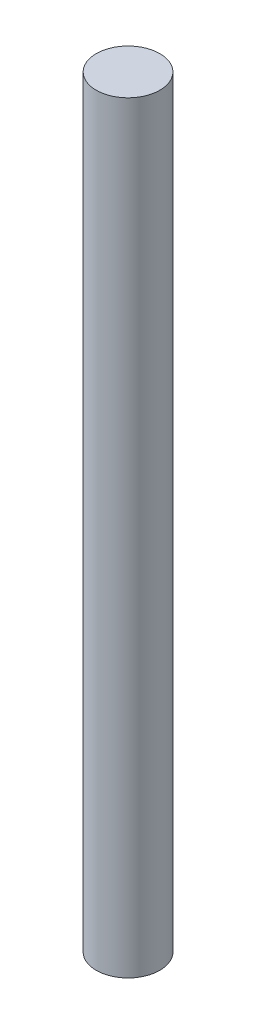
ISO-10303-21;
HEADER;
FILE_DESCRIPTION(('STEP AP214'),'2;1');
FILE_NAME('part.step','',(''),(''),'','','');
FILE_SCHEMA(('AUTOMOTIVE_DESIGN { 1 0 10303 214 1 1 1 1 }'));
ENDSEC;
DATA;
#1=APPLICATION_CONTEXT('core data for automotive mechanical design processes');
#2=APPLICATION_PROTOCOL_DEFINITION('international standard','automotive_design',2000,#1);
#3=PRODUCT_CONTEXT('',#1,'mechanical');
#4=PRODUCT('Part','Part','',(#3));
#5=PRODUCT_RELATED_PRODUCT_CATEGORY('part','',(#4));
#6=PRODUCT_DEFINITION_FORMATION('','',#4);
#7=PRODUCT_DEFINITION_CONTEXT('part definition',#1,'design');
#8=PRODUCT_DEFINITION('design','',#6,#7);
#9=PRODUCT_DEFINITION_SHAPE('','',#8);
#10=(LENGTH_UNIT() NAMED_UNIT(*) SI_UNIT(.MILLI.,.METRE.));
#11=(NAMED_UNIT(*) PLANE_ANGLE_UNIT() SI_UNIT($,.RADIAN.));
#12=(NAMED_UNIT(*) SI_UNIT($,.STERADIAN.) SOLID_ANGLE_UNIT());
#13=UNCERTAINTY_MEASURE_WITH_UNIT(LENGTH_MEASURE(1.E-05),#10,'distance_accuracy_value','');
#14=(GEOMETRIC_REPRESENTATION_CONTEXT(3) GLOBAL_UNCERTAINTY_ASSIGNED_CONTEXT((#13)) GLOBAL_UNIT_ASSIGNED_CONTEXT((#10,
#11,#12)) REPRESENTATION_CONTEXT('',''));
#15=CARTESIAN_POINT('',(0.,0.,0.));
#16=DIRECTION('',(0.,0.,1.));
#17=DIRECTION('',(1.,0.,0.));
#18=AXIS2_PLACEMENT_3D('',#15,#16,#17);
#19=CARTESIAN_POINT('',(0.,76.2,0.));
#20=DIRECTION('',(0.,-1.,0.));
#21=DIRECTION('',(0.,0.,-1.));
#22=AXIS2_PLACEMENT_3D('',#19,#20,#21);
#23=CYLINDRICAL_SURFACE('',#22,3.175);
#24=CARTESIAN_POINT('',(0.,76.2,0.));
#25=DIRECTION('',(0.,1.,0.));
#26=DIRECTION('',(0.,0.,1.));
#27=AXIS2_PLACEMENT_3D('',#24,#25,#26);
#28=CIRCLE('',#27,3.175);
#29=CARTESIAN_POINT('',(0.,76.2,-3.175));
#30=VERTEX_POINT('',#29);
#31=EDGE_CURVE('E10',#30,#30,#28,.T.);
#32=CARTESIAN_POINT('',(0.,0.,0.));
#33=DIRECTION('',(0.,1.,0.));
#34=DIRECTION('',(0.,0.,1.));
#35=AXIS2_PLACEMENT_3D('',#32,#33,#34);
#36=CIRCLE('',#35,3.175);
#37=CARTESIAN_POINT('',(0.,0.,-3.175));
#38=VERTEX_POINT('',#37);
#39=EDGE_CURVE('E36',#38,#38,#36,.T.);
#40=CARTESIAN_POINT('',(0.,76.2,-3.175));
#41=CARTESIAN_POINT('',(0.,75.40625,-3.175));
#42=CARTESIAN_POINT('',(0.,74.6125,-3.175));
#43=CARTESIAN_POINT('',(0.,73.025,-3.175));
#44=CARTESIAN_POINT('',(0.,72.23125,-3.175));
#45=CARTESIAN_POINT('',(0.,70.64375,-3.175));
#46=CARTESIAN_POINT('',(0.,69.85,-3.175));
#47=CARTESIAN_POINT('',(0.,68.2625,-3.175));
#48=CARTESIAN_POINT('',(0.,67.46875,-3.175));
#49=CARTESIAN_POINT('',(0.,65.88125,-3.175));
#50=CARTESIAN_POINT('',(0.,65.0875,-3.175));
#51=CARTESIAN_POINT('',(0.,63.5,-3.175));
#52=CARTESIAN_POINT('',(0.,62.70625,-3.175));
#53=CARTESIAN_POINT('',(0.,61.11875,-3.175));
#54=CARTESIAN_POINT('',(0.,60.325,-3.175));
#55=CARTESIAN_POINT('',(0.,58.7375,-3.175));
#56=CARTESIAN_POINT('',(0.,57.94375,-3.175));
#57=CARTESIAN_POINT('',(0.,56.35625,-3.175));
#58=CARTESIAN_POINT('',(0.,55.5625,-3.175));
#59=CARTESIAN_POINT('',(0.,53.975,-3.175));
#60=CARTESIAN_POINT('',(0.,53.18125,-3.175));
#61=CARTESIAN_POINT('',(0.,51.59375,-3.175));
#62=CARTESIAN_POINT('',(0.,50.8,-3.175));
#63=CARTESIAN_POINT('',(0.,49.2125,-3.175));
#64=CARTESIAN_POINT('',(0.,48.41875,-3.175));
#65=CARTESIAN_POINT('',(0.,46.83125,-3.175));
#66=CARTESIAN_POINT('',(0.,46.0375,-3.175));
#67=CARTESIAN_POINT('',(0.,44.45,-3.175));
#68=CARTESIAN_POINT('',(0.,43.65625,-3.175));
#69=CARTESIAN_POINT('',(0.,42.06875,-3.175));
#70=CARTESIAN_POINT('',(0.,41.275,-3.175));
#71=CARTESIAN_POINT('',(0.,39.6875,-3.175));
#72=CARTESIAN_POINT('',(0.,38.89375,-3.175));
#73=CARTESIAN_POINT('',(0.,37.30625,-3.175));
#74=CARTESIAN_POINT('',(0.,36.5125,-3.175));
#75=CARTESIAN_POINT('',(0.,34.925,-3.175));
#76=CARTESIAN_POINT('',(0.,34.13125,-3.175));
#77=CARTESIAN_POINT('',(0.,32.54375,-3.175));
#78=CARTESIAN_POINT('',(0.,31.75,-3.175));
#79=CARTESIAN_POINT('',(0.,30.1625,-3.175));
#80=CARTESIAN_POINT('',(0.,29.36875,-3.175));
#81=CARTESIAN_POINT('',(0.,27.78125,-3.175));
#82=CARTESIAN_POINT('',(0.,26.9875,-3.175));
#83=CARTESIAN_POINT('',(0.,25.4,-3.175));
#84=CARTESIAN_POINT('',(0.,24.60625,-3.175));
#85=CARTESIAN_POINT('',(0.,23.01875,-3.175));
#86=CARTESIAN_POINT('',(0.,22.225,-3.175));
#87=CARTESIAN_POINT('',(0.,20.6375,-3.175));
#88=CARTESIAN_POINT('',(0.,19.84375,-3.175));
#89=CARTESIAN_POINT('',(0.,18.25625,-3.175));
#90=CARTESIAN_POINT('',(0.,17.4625,-3.175));
#91=CARTESIAN_POINT('',(0.,15.875,-3.175));
#92=CARTESIAN_POINT('',(0.,15.08125,-3.175));
#93=CARTESIAN_POINT('',(0.,13.49375,-3.175));
#94=CARTESIAN_POINT('',(0.,12.7,-3.175));
#95=CARTESIAN_POINT('',(0.,11.1125,-3.175));
#96=CARTESIAN_POINT('',(0.,10.31875,-3.175));
#97=CARTESIAN_POINT('',(0.,8.73125,-3.175));
#98=CARTESIAN_POINT('',(0.,7.93750000000001,-3.175));
#99=CARTESIAN_POINT('',(0.,6.35,-3.175));
#100=CARTESIAN_POINT('',(0.,5.55625,-3.175));
#101=CARTESIAN_POINT('',(0.,3.96875,-3.175));
#102=CARTESIAN_POINT('',(0.,3.175,-3.175));
#103=CARTESIAN_POINT('',(0.,1.5875,-3.175));
#104=CARTESIAN_POINT('',(0.,0.793750000000001,-3.175));
#105=CARTESIAN_POINT('',(0.,0.,-3.175));
#106=B_SPLINE_CURVE_WITH_KNOTS('',3,(#40,#41,#42,#43,#44,#45,#46,#47,#48,#49,#50,#51,#52,#53,
#54,#55,#56,#57,#58,#59,#60,#61,#62,#63,#64,#65,#66,#67,#68,#69,#70,#71,#72,#73,#74,#75,#76,#77,
#78,#79,#80,#81,#82,#83,#84,#85,#86,#87,#88,#89,#90,#91,#92,#93,#94,#95,#96,#97,#98,#99,#100,
#101,#102,#103,#104,#105),.UNSPECIFIED.,.F.,.F.,(4,2,2,2,2,2,2,2,2,2,2,2,2,2,2,2,2,2,2,2,2,2,2,
2,2,2,2,2,2,2,2,2,4),(0.,2.38125,4.7625,7.14375,9.52500000000001,11.90625,14.2875,16.66875,
19.05,21.43125,23.8125,26.19375,28.575,30.95625,33.3375,35.71875,38.1,40.48125,42.8625,45.24375,
47.625,50.00625,52.3875,54.76875,57.15,59.53125,61.9125,64.29375,66.675,69.05625,71.4375,
73.81875,76.2),.UNSPECIFIED.);
#107=EDGE_CURVE('BSEAM33',#30,#38,#106,.T.);
#108=ORIENTED_EDGE('',*,*,#31,.F.);
#109=ORIENTED_EDGE('',*,*,#39,.T.);
#110=ORIENTED_EDGE('',*,*,#107,.T.);
#111=ORIENTED_EDGE('',*,*,#107,.F.);
#112=EDGE_LOOP('',(#108,#110,#109,#111));
#113=FACE_BOUND('',#112,.T.);
#114=ADVANCED_FACE('F33',(#113),#23,.T.);
#115=CARTESIAN_POINT('',(0.,76.2,0.));
#116=DIRECTION('',(0.,1.,0.));
#117=DIRECTION('',(0.,0.,1.));
#118=AXIS2_PLACEMENT_3D('',#115,#116,#117);
#119=PLANE('',#118);
#120=ORIENTED_EDGE('',*,*,#31,.T.);
#121=EDGE_LOOP('',(#120));
#122=FACE_BOUND('',#121,.T.);
#123=ADVANCED_FACE('F48',(#122),#119,.T.);
#124=CARTESIAN_POINT('',(0.,0.,0.));
#125=DIRECTION('',(0.,1.,0.));
#126=DIRECTION('',(0.,0.,1.));
#127=AXIS2_PLACEMENT_3D('',#124,#125,#126);
#128=PLANE('',#127);
#129=ORIENTED_EDGE('',*,*,#39,.F.);
#130=EDGE_LOOP('',(#129));
#131=FACE_BOUND('',#130,.T.);
#132=ADVANCED_FACE('F46',(#131),#128,.F.);
#133=CLOSED_SHELL('',(#114,#123,#132));
#134=MANIFOLD_SOLID_BREP('B2',#133);
#135=ADVANCED_BREP_SHAPE_REPRESENTATION('',(#18,#134),#14);
#136=SHAPE_DEFINITION_REPRESENTATION(#9,#135);
ENDSEC;
END-ISO-10303-21;
